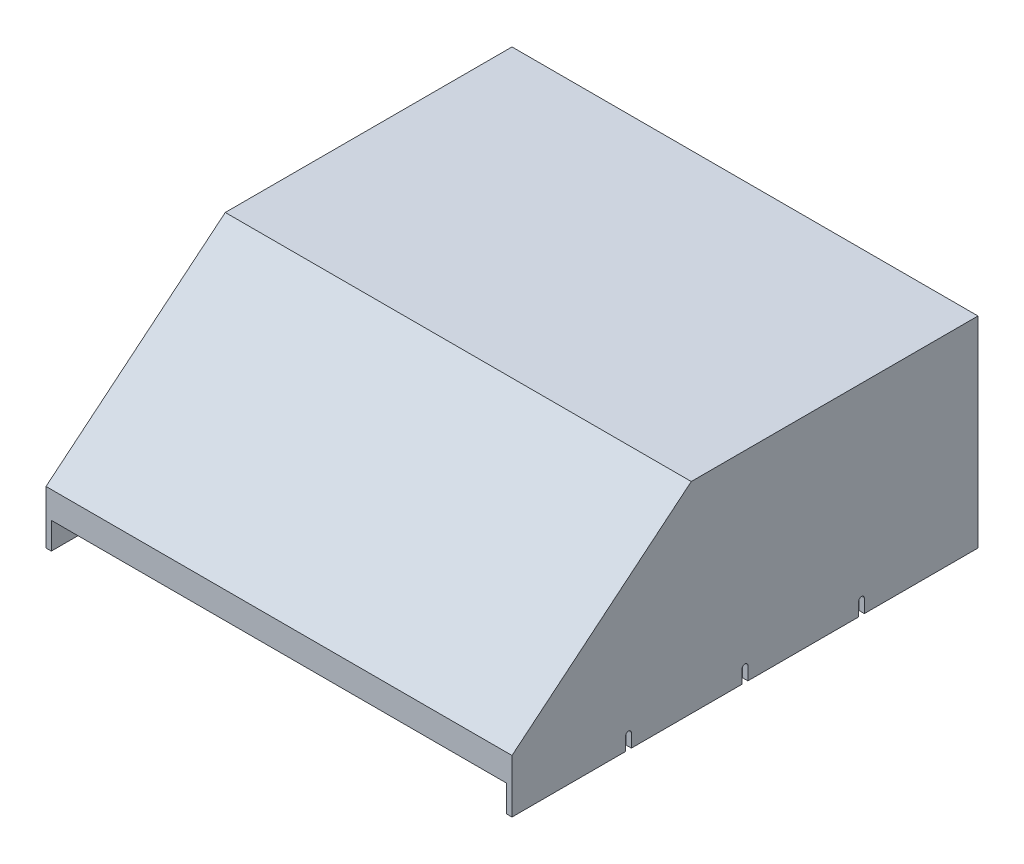
ISO-10303-21;
HEADER;
FILE_DESCRIPTION(('STEP AP214'),'2;1');
FILE_NAME('part.step','',(''),(''),'','','');
FILE_SCHEMA(('AUTOMOTIVE_DESIGN { 1 0 10303 214 1 1 1 1 }'));
ENDSEC;
DATA;
#1=APPLICATION_CONTEXT('core data for automotive mechanical design processes');
#2=APPLICATION_PROTOCOL_DEFINITION('international standard','automotive_design',2000,#1);
#3=PRODUCT_CONTEXT('',#1,'mechanical');
#4=PRODUCT('Part','Part','',(#3));
#5=PRODUCT_RELATED_PRODUCT_CATEGORY('part','',(#4));
#6=PRODUCT_DEFINITION_FORMATION('','',#4);
#7=PRODUCT_DEFINITION_CONTEXT('part definition',#1,'design');
#8=PRODUCT_DEFINITION('design','',#6,#7);
#9=PRODUCT_DEFINITION_SHAPE('','',#8);
#10=(LENGTH_UNIT() NAMED_UNIT(*) SI_UNIT(.MILLI.,.METRE.));
#11=(NAMED_UNIT(*) PLANE_ANGLE_UNIT() SI_UNIT($,.RADIAN.));
#12=(NAMED_UNIT(*) SI_UNIT($,.STERADIAN.) SOLID_ANGLE_UNIT());
#13=UNCERTAINTY_MEASURE_WITH_UNIT(LENGTH_MEASURE(1.E-05),#10,'distance_accuracy_value','');
#14=(GEOMETRIC_REPRESENTATION_CONTEXT(3) GLOBAL_UNCERTAINTY_ASSIGNED_CONTEXT((#13)) GLOBAL_UNIT_ASSIGNED_CONTEXT((#10,
#11,#12)) REPRESENTATION_CONTEXT('',''));
#15=CARTESIAN_POINT('',(0.,0.,0.));
#16=DIRECTION('',(0.,0.,1.));
#17=DIRECTION('',(1.,0.,0.));
#18=AXIS2_PLACEMENT_3D('',#15,#16,#17);
#19=CARTESIAN_POINT('',(524.,0.,0.));
#20=DIRECTION('',(0.,1.,0.));
#21=DIRECTION('',(0.,0.,1.));
#22=AXIS2_PLACEMENT_3D('',#19,#20,#21);
#23=PLANE('',#22);
#24=DIRECTION('',(0.,0.,-1.));
#25=VECTOR('',#24,1.);
#26=CARTESIAN_POINT('',(518.,0.,0.));
#27=LINE('',#26,#25);
#28=CARTESIAN_POINT('',(518.,0.,-134.25));
#29=VERTEX_POINT('',#28);
#30=CARTESIAN_POINT('',(518.,0.,-258.75));
#31=VERTEX_POINT('',#30);
#32=EDGE_CURVE('E476',#29,#31,#27,.T.);
#33=ORIENTED_EDGE('',*,*,#32,.T.);
#34=DIRECTION('',(-1.,0.,0.));
#35=VECTOR('',#34,1.);
#36=CARTESIAN_POINT('',(524.,0.,-258.75));
#37=LINE('',#36,#35);
#38=CARTESIAN_POINT('',(524.,0.,-258.75));
#39=VERTEX_POINT('',#38);
#40=EDGE_CURVE('E316',#39,#31,#37,.T.);
#41=ORIENTED_EDGE('',*,*,#40,.F.);
#42=DIRECTION('',(0.,0.,-1.));
#43=VECTOR('',#42,1.);
#44=CARTESIAN_POINT('',(524.,0.,0.));
#45=LINE('',#44,#43);
#46=CARTESIAN_POINT('',(524.,0.,-134.25));
#47=VERTEX_POINT('',#46);
#48=EDGE_CURVE('E487',#47,#39,#45,.T.);
#49=ORIENTED_EDGE('',*,*,#48,.F.);
#50=DIRECTION('',(-1.,0.,0.));
#51=VECTOR('',#50,1.);
#52=CARTESIAN_POINT('',(524.,0.,-134.25));
#53=LINE('',#52,#51);
#54=EDGE_CURVE('E351',#47,#29,#53,.T.);
#55=ORIENTED_EDGE('',*,*,#54,.T.);
#56=EDGE_LOOP('',(#33,#41,#49,#55));
#57=FACE_BOUND('',#56,.T.);
#58=ADVANCED_FACE('F37',(#57),#23,.F.);
#59=DIRECTION('',(0.,0.,-1.));
#60=VECTOR('',#59,1.);
#61=CARTESIAN_POINT('',(0.,0.,0.));
#62=LINE('',#61,#60);
#63=CARTESIAN_POINT('',(0.,0.,-134.25));
#64=VERTEX_POINT('',#63);
#65=CARTESIAN_POINT('',(0.,0.,-258.75));
#66=VERTEX_POINT('',#65);
#67=EDGE_CURVE('E503',#64,#66,#62,.T.);
#68=ORIENTED_EDGE('',*,*,#67,.T.);
#69=CARTESIAN_POINT('',(6.00000000000001,0.,-258.75));
#70=VERTEX_POINT('',#69);
#71=EDGE_CURVE('E318',#70,#66,#37,.T.);
#72=ORIENTED_EDGE('',*,*,#71,.F.);
#73=DIRECTION('',(0.,0.,-1.));
#74=VECTOR('',#73,1.);
#75=CARTESIAN_POINT('',(6.00000000000001,0.,0.));
#76=LINE('',#75,#74);
#77=CARTESIAN_POINT('',(6.00000000000001,0.,-134.25));
#78=VERTEX_POINT('',#77);
#79=EDGE_CURVE('E472',#78,#70,#76,.T.);
#80=ORIENTED_EDGE('',*,*,#79,.F.);
#81=EDGE_CURVE('E354',#78,#64,#53,.T.);
#82=ORIENTED_EDGE('',*,*,#81,.T.);
#83=EDGE_LOOP('',(#68,#72,#80,#82));
#84=FACE_BOUND('',#83,.T.);
#85=ADVANCED_FACE('F577',(#84),#23,.F.);
#86=CARTESIAN_POINT('',(518.,0.,0.));
#87=VERTEX_POINT('',#86);
#88=CARTESIAN_POINT('',(518.,0.,-127.75));
#89=VERTEX_POINT('',#88);
#90=EDGE_CURVE('E469',#87,#89,#27,.T.);
#91=ORIENTED_EDGE('',*,*,#90,.T.);
#92=DIRECTION('',(-1.,0.,0.));
#93=VECTOR('',#92,1.);
#94=CARTESIAN_POINT('',(524.,0.,-127.75));
#95=LINE('',#94,#93);
#96=CARTESIAN_POINT('',(524.,0.,-127.75));
#97=VERTEX_POINT('',#96);
#98=EDGE_CURVE('E348',#97,#89,#95,.T.);
#99=ORIENTED_EDGE('',*,*,#98,.F.);
#100=CARTESIAN_POINT('',(524.,0.,0.));
#101=VERTEX_POINT('',#100);
#102=EDGE_CURVE('E483',#101,#97,#45,.T.);
#103=ORIENTED_EDGE('',*,*,#102,.F.);
#104=DIRECTION('',(-1.,0.,0.));
#105=VECTOR('',#104,1.);
#106=CARTESIAN_POINT('',(524.,0.,0.));
#107=LINE('',#106,#105);
#108=EDGE_CURVE('E522',#101,#87,#107,.T.);
#109=ORIENTED_EDGE('',*,*,#108,.T.);
#110=EDGE_LOOP('',(#91,#99,#103,#109));
#111=FACE_BOUND('',#110,.T.);
#112=ADVANCED_FACE('F620',(#111),#23,.F.);
#113=CARTESIAN_POINT('',(0.,0.,0.));
#114=VERTEX_POINT('',#113);
#115=CARTESIAN_POINT('',(0.,0.,-127.75));
#116=VERTEX_POINT('',#115);
#117=EDGE_CURVE('E499',#114,#116,#62,.T.);
#118=ORIENTED_EDGE('',*,*,#117,.T.);
#119=CARTESIAN_POINT('',(6.00000000000001,0.,-127.75));
#120=VERTEX_POINT('',#119);
#121=EDGE_CURVE('E350',#120,#116,#95,.T.);
#122=ORIENTED_EDGE('',*,*,#121,.F.);
#123=CARTESIAN_POINT('',(6.,0.,0.));
#124=VERTEX_POINT('',#123);
#125=EDGE_CURVE('E467',#124,#120,#76,.T.);
#126=ORIENTED_EDGE('',*,*,#125,.F.);
#127=EDGE_CURVE('E521',#124,#114,#107,.T.);
#128=ORIENTED_EDGE('',*,*,#127,.T.);
#129=EDGE_LOOP('',(#118,#122,#126,#128));
#130=FACE_BOUND('',#129,.T.);
#131=ADVANCED_FACE('F715',(#130),#23,.F.);
#132=CARTESIAN_POINT('',(524.,0.,-265.25));
#133=VERTEX_POINT('',#132);
#134=CARTESIAN_POINT('',(524.,0.,-389.75));
#135=VERTEX_POINT('',#134);
#136=EDGE_CURVE('E488',#133,#135,#45,.T.);
#137=ORIENTED_EDGE('',*,*,#136,.F.);
#138=DIRECTION('',(-1.,0.,0.));
#139=VECTOR('',#138,1.);
#140=CARTESIAN_POINT('',(524.,0.,-265.25));
#141=LINE('',#140,#139);
#142=CARTESIAN_POINT('',(518.,0.,-265.25));
#143=VERTEX_POINT('',#142);
#144=EDGE_CURVE('E294',#133,#143,#141,.T.);
#145=ORIENTED_EDGE('',*,*,#144,.T.);
#146=CARTESIAN_POINT('',(518.,0.,-389.75));
#147=VERTEX_POINT('',#146);
#148=EDGE_CURVE('E477',#143,#147,#27,.T.);
#149=ORIENTED_EDGE('',*,*,#148,.T.);
#150=DIRECTION('',(-1.,0.,0.));
#151=VECTOR('',#150,1.);
#152=CARTESIAN_POINT('',(524.,0.,-389.75));
#153=LINE('',#152,#151);
#154=EDGE_CURVE('E388',#135,#147,#153,.T.);
#155=ORIENTED_EDGE('',*,*,#154,.F.);
#156=EDGE_LOOP('',(#137,#145,#149,#155));
#157=FACE_BOUND('',#156,.T.);
#158=ADVANCED_FACE('F642',(#157),#23,.F.);
#159=CARTESIAN_POINT('',(6.00000000000001,0.,-265.25));
#160=VERTEX_POINT('',#159);
#161=CARTESIAN_POINT('',(6.00000000000001,0.,-389.75));
#162=VERTEX_POINT('',#161);
#163=EDGE_CURVE('E473',#160,#162,#76,.T.);
#164=ORIENTED_EDGE('',*,*,#163,.F.);
#165=CARTESIAN_POINT('',(0.,0.,-265.25));
#166=VERTEX_POINT('',#165);
#167=EDGE_CURVE('E60',#160,#166,#141,.T.);
#168=ORIENTED_EDGE('',*,*,#167,.T.);
#169=CARTESIAN_POINT('',(0.,0.,-389.75));
#170=VERTEX_POINT('',#169);
#171=EDGE_CURVE('E504',#166,#170,#62,.T.);
#172=ORIENTED_EDGE('',*,*,#171,.T.);
#173=EDGE_CURVE('E391',#162,#170,#153,.T.);
#174=ORIENTED_EDGE('',*,*,#173,.F.);
#175=EDGE_LOOP('',(#164,#168,#172,#174));
#176=FACE_BOUND('',#175,.T.);
#177=ADVANCED_FACE('F587',(#176),#23,.F.);
#178=CARTESIAN_POINT('',(524.,0.,-396.25));
#179=VERTEX_POINT('',#178);
#180=CARTESIAN_POINT('',(524.,0.,-524.));
#181=VERTEX_POINT('',#180);
#182=EDGE_CURVE('E481',#179,#181,#45,.T.);
#183=ORIENTED_EDGE('',*,*,#182,.F.);
#184=DIRECTION('',(-1.,0.,0.));
#185=VECTOR('',#184,1.);
#186=CARTESIAN_POINT('',(524.,0.,-396.25));
#187=LINE('',#186,#185);
#188=CARTESIAN_POINT('',(518.,0.,-396.25));
#189=VERTEX_POINT('',#188);
#190=EDGE_CURVE('E392',#179,#189,#187,.T.);
#191=ORIENTED_EDGE('',*,*,#190,.T.);
#192=CARTESIAN_POINT('',(518.,0.,-524.));
#193=VERTEX_POINT('',#192);
#194=EDGE_CURVE('E444',#189,#193,#27,.T.);
#195=ORIENTED_EDGE('',*,*,#194,.T.);
#196=DIRECTION('',(-1.,0.,0.));
#197=VECTOR('',#196,1.);
#198=CARTESIAN_POINT('',(524.,0.,-524.));
#199=LINE('',#198,#197);
#200=EDGE_CURVE('E518',#181,#193,#199,.T.);
#201=ORIENTED_EDGE('',*,*,#200,.F.);
#202=EDGE_LOOP('',(#183,#191,#195,#201));
#203=FACE_BOUND('',#202,.T.);
#204=ADVANCED_FACE('F625',(#203),#23,.F.);
#205=CARTESIAN_POINT('',(524.,-5.08934094474187E-13,-518.));
#206=DIRECTION('',(0.,0.,1.));
#207=DIRECTION('',(0.,-1.,0.));
#208=AXIS2_PLACEMENT_3D('',#205,#206,#207);
#209=PLANE('',#208);
#210=DIRECTION('',(0.,1.,0.));
#211=VECTOR('',#210,1.);
#212=CARTESIAN_POINT('',(6.00000000000001,-5.08934094474187E-13,-518.));
#213=LINE('',#212,#211);
#214=CARTESIAN_POINT('',(6.00000000000001,80.,-518.));
#215=VERTEX_POINT('',#214);
#216=CARTESIAN_POINT('',(6.,220.,-518.));
#217=VERTEX_POINT('',#216);
#218=EDGE_CURVE('E460',#215,#217,#213,.T.);
#219=ORIENTED_EDGE('',*,*,#218,.F.);
#220=DIRECTION('',(-1.,0.,0.));
#221=VECTOR('',#220,1.);
#222=CARTESIAN_POINT('',(518.,80.,-518.));
#223=LINE('',#222,#221);
#224=CARTESIAN_POINT('',(518.,80.,-518.));
#225=VERTEX_POINT('',#224);
#226=EDGE_CURVE('E406',#225,#215,#223,.T.);
#227=ORIENTED_EDGE('',*,*,#226,.F.);
#228=DIRECTION('',(0.,1.,0.));
#229=VECTOR('',#228,1.);
#230=CARTESIAN_POINT('',(518.,-5.08934094474187E-13,-518.));
#231=LINE('',#230,#229);
#232=CARTESIAN_POINT('',(518.,220.,-518.));
#233=VERTEX_POINT('',#232);
#234=EDGE_CURVE('E462',#225,#233,#231,.T.);
#235=ORIENTED_EDGE('',*,*,#234,.T.);
#236=DIRECTION('',(-1.,0.,0.));
#237=VECTOR('',#236,1.);
#238=CARTESIAN_POINT('',(524.,220.,-518.));
#239=LINE('',#238,#237);
#240=EDGE_CURVE('E457',#233,#217,#239,.T.);
#241=ORIENTED_EDGE('',*,*,#240,.T.);
#242=EDGE_LOOP('',(#219,#227,#235,#241));
#243=FACE_BOUND('',#242,.T.);
#244=ADVANCED_FACE('F631',(#243),#209,.T.);
#245=CARTESIAN_POINT('',(524.,0.,-6.));
#246=DIRECTION('',(0.,0.,-1.));
#247=DIRECTION('',(0.,1.,0.));
#248=AXIS2_PLACEMENT_3D('',#245,#246,#247);
#249=PLANE('',#248);
#250=DIRECTION('',(0.,-1.,0.));
#251=VECTOR('',#250,1.);
#252=CARTESIAN_POINT('',(518.,0.,-6.));
#253=LINE('',#252,#251);
#254=CARTESIAN_POINT('',(518.,57.1684113347274,-6.00000000000021));
#255=VERTEX_POINT('',#254);
#256=CARTESIAN_POINT('',(518.,30.,-6.));
#257=VERTEX_POINT('',#256);
#258=EDGE_CURVE('E441',#255,#257,#253,.T.);
#259=ORIENTED_EDGE('',*,*,#258,.T.);
#260=DIRECTION('',(1.,0.,0.));
#261=VECTOR('',#260,1.);
#262=CARTESIAN_POINT('',(6.,30.,-6.));
#263=LINE('',#262,#261);
#264=CARTESIAN_POINT('',(6.,30.,-6.));
#265=VERTEX_POINT('',#264);
#266=EDGE_CURVE('E419',#265,#257,#263,.T.);
#267=ORIENTED_EDGE('',*,*,#266,.F.);
#268=DIRECTION('',(0.,-1.,0.));
#269=VECTOR('',#268,1.);
#270=CARTESIAN_POINT('',(6.00000000000001,0.,-6.));
#271=LINE('',#270,#269);
#272=CARTESIAN_POINT('',(6.,57.1684113347274,-6.00000000000021));
#273=VERTEX_POINT('',#272);
#274=EDGE_CURVE('E435',#273,#265,#271,.T.);
#275=ORIENTED_EDGE('',*,*,#274,.F.);
#276=DIRECTION('',(-1.,0.,0.));
#277=VECTOR('',#276,1.);
#278=CARTESIAN_POINT('',(524.,57.1684113347274,-6.00000000000021));
#279=LINE('',#278,#277);
#280=EDGE_CURVE('E446',#255,#273,#279,.T.);
#281=ORIENTED_EDGE('',*,*,#280,.F.);
#282=EDGE_LOOP('',(#259,#267,#275,#281));
#283=FACE_BOUND('',#282,.T.);
#284=ADVANCED_FACE('F624',(#283),#249,.T.);
#285=CARTESIAN_POINT('',(6.00000000000001,0.,-396.25));
#286=VERTEX_POINT('',#285);
#287=CARTESIAN_POINT('',(6.,0.,-524.));
#288=VERTEX_POINT('',#287);
#289=EDGE_CURVE('E440',#286,#288,#76,.T.);
#290=ORIENTED_EDGE('',*,*,#289,.F.);
#291=CARTESIAN_POINT('',(0.,0.,-396.25));
#292=VERTEX_POINT('',#291);
#293=EDGE_CURVE('E395',#286,#292,#187,.T.);
#294=ORIENTED_EDGE('',*,*,#293,.T.);
#295=CARTESIAN_POINT('',(0.,0.,-524.));
#296=VERTEX_POINT('',#295);
#297=EDGE_CURVE('E498',#292,#296,#62,.T.);
#298=ORIENTED_EDGE('',*,*,#297,.T.);
#299=EDGE_CURVE('E517',#288,#296,#199,.T.);
#300=ORIENTED_EDGE('',*,*,#299,.F.);
#301=EDGE_LOOP('',(#290,#294,#298,#300));
#302=FACE_BOUND('',#301,.T.);
#303=ADVANCED_FACE('F571',(#302),#23,.F.);
#304=CARTESIAN_POINT('',(524.,0.,0.));
#305=DIRECTION('',(0.,0.,-1.));
#306=DIRECTION('',(0.,1.,0.));
#307=AXIS2_PLACEMENT_3D('',#304,#305,#306);
#308=PLANE('',#307);
#309=ORIENTED_EDGE('',*,*,#127,.F.);
#310=DIRECTION('',(0.,-1.,0.));
#311=VECTOR('',#310,1.);
#312=CARTESIAN_POINT('',(6.,30.,0.));
#313=LINE('',#312,#311);
#314=CARTESIAN_POINT('',(6.,30.,0.));
#315=VERTEX_POINT('',#314);
#316=EDGE_CURVE('E432',#315,#124,#313,.T.);
#317=ORIENTED_EDGE('',*,*,#316,.F.);
#318=DIRECTION('',(-1.,0.,0.));
#319=VECTOR('',#318,1.);
#320=CARTESIAN_POINT('',(518.,30.,0.));
#321=LINE('',#320,#319);
#322=CARTESIAN_POINT('',(518.,30.,0.));
#323=VERTEX_POINT('',#322);
#324=EDGE_CURVE('E427',#323,#315,#321,.T.);
#325=ORIENTED_EDGE('',*,*,#324,.F.);
#326=DIRECTION('',(0.,-1.,0.));
#327=VECTOR('',#326,1.);
#328=CARTESIAN_POINT('',(518.,30.,0.));
#329=LINE('',#328,#327);
#330=EDGE_CURVE('E431',#323,#87,#329,.T.);
#331=ORIENTED_EDGE('',*,*,#330,.T.);
#332=ORIENTED_EDGE('',*,*,#108,.F.);
#333=DIRECTION('',(0.,-1.,0.));
#334=VECTOR('',#333,1.);
#335=CARTESIAN_POINT('',(524.,0.,0.));
#336=LINE('',#335,#334);
#337=CARTESIAN_POINT('',(524.,60.0000000000001,-2.22044604925031E-13));
#338=VERTEX_POINT('',#337);
#339=EDGE_CURVE('E478',#338,#101,#336,.T.);
#340=ORIENTED_EDGE('',*,*,#339,.F.);
#341=DIRECTION('',(-1.,0.,0.));
#342=VECTOR('',#341,1.);
#343=CARTESIAN_POINT('',(524.,60.0000000000001,-2.22044604925031E-13));
#344=LINE('',#343,#342);
#345=CARTESIAN_POINT('',(0.,60.0000000000001,-2.22044604925031E-13));
#346=VERTEX_POINT('',#345);
#347=EDGE_CURVE('E495',#338,#346,#344,.T.);
#348=ORIENTED_EDGE('',*,*,#347,.T.);
#349=DIRECTION('',(0.,-1.,0.));
#350=VECTOR('',#349,1.);
#351=CARTESIAN_POINT('',(0.,0.,0.));
#352=LINE('',#351,#350);
#353=EDGE_CURVE('E465',#346,#114,#352,.T.);
#354=ORIENTED_EDGE('',*,*,#353,.T.);
#355=EDGE_LOOP('',(#309,#317,#325,#331,#332,#340,#348,#354));
#356=FACE_BOUND('',#355,.T.);
#357=ADVANCED_FACE('F39',(#356),#308,.F.);
#358=CARTESIAN_POINT('',(524.,-5.14829083985471E-13,-524.));
#359=DIRECTION('',(0.,0.,1.));
#360=DIRECTION('',(0.,-1.,0.));
#361=AXIS2_PLACEMENT_3D('',#358,#359,#360);
#362=PLANE('',#361);
#363=ORIENTED_EDGE('',*,*,#200,.T.);
#364=DIRECTION('',(0.,-1.,0.));
#365=VECTOR('',#364,1.);
#366=CARTESIAN_POINT('',(518.,80.,-524.));
#367=LINE('',#366,#365);
#368=CARTESIAN_POINT('',(518.,80.,-524.));
#369=VERTEX_POINT('',#368);
#370=EDGE_CURVE('E416',#369,#193,#367,.T.);
#371=ORIENTED_EDGE('',*,*,#370,.F.);
#372=DIRECTION('',(1.,0.,0.));
#373=VECTOR('',#372,1.);
#374=CARTESIAN_POINT('',(518.,80.,-524.));
#375=LINE('',#374,#373);
#376=CARTESIAN_POINT('',(6.,80.,-524.));
#377=VERTEX_POINT('',#376);
#378=EDGE_CURVE('E411',#377,#369,#375,.T.);
#379=ORIENTED_EDGE('',*,*,#378,.F.);
#380=DIRECTION('',(0.,-1.,0.));
#381=VECTOR('',#380,1.);
#382=CARTESIAN_POINT('',(6.,80.,-524.));
#383=LINE('',#382,#381);
#384=EDGE_CURVE('E415',#377,#288,#383,.T.);
#385=ORIENTED_EDGE('',*,*,#384,.T.);
#386=ORIENTED_EDGE('',*,*,#299,.T.);
#387=DIRECTION('',(0.,1.,0.));
#388=VECTOR('',#387,1.);
#389=CARTESIAN_POINT('',(0.,-5.14829083985471E-13,-524.));
#390=LINE('',#389,#388);
#391=CARTESIAN_POINT('',(0.,226.,-524.));
#392=VERTEX_POINT('',#391);
#393=EDGE_CURVE('E502',#296,#392,#390,.T.);
#394=ORIENTED_EDGE('',*,*,#393,.T.);
#395=DIRECTION('',(-1.,0.,0.));
#396=VECTOR('',#395,1.);
#397=CARTESIAN_POINT('',(524.,226.,-524.));
#398=LINE('',#397,#396);
#399=CARTESIAN_POINT('',(524.,226.,-524.));
#400=VERTEX_POINT('',#399);
#401=EDGE_CURVE('E514',#400,#392,#398,.T.);
#402=ORIENTED_EDGE('',*,*,#401,.F.);
#403=DIRECTION('',(0.,1.,0.));
#404=VECTOR('',#403,1.);
#405=CARTESIAN_POINT('',(524.,-5.14829083985471E-13,-524.));
#406=LINE('',#405,#404);
#407=EDGE_CURVE('E486',#181,#400,#406,.T.);
#408=ORIENTED_EDGE('',*,*,#407,.F.);
#409=EDGE_LOOP('',(#363,#371,#379,#385,#386,#394,#402,#408));
#410=FACE_BOUND('',#409,.T.);
#411=ADVANCED_FACE('F568',(#410),#362,.F.);
#412=CARTESIAN_POINT('',(524.,226.,0.));
#413=DIRECTION('',(0.,-1.,0.));
#414=DIRECTION('',(0.,0.,-1.));
#415=AXIS2_PLACEMENT_3D('',#412,#413,#414);
#416=PLANE('',#415);
#417=DIRECTION('',(0.,0.,1.));
#418=VECTOR('',#417,1.);
#419=CARTESIAN_POINT('',(0.,226.,0.));
#420=LINE('',#419,#418);
#421=CARTESIAN_POINT('',(0.,226.,-201.57613210619));
#422=VERTEX_POINT('',#421);
#423=EDGE_CURVE('E506',#392,#422,#420,.T.);
#424=ORIENTED_EDGE('',*,*,#423,.T.);
#425=DIRECTION('',(-1.,0.,0.));
#426=VECTOR('',#425,1.);
#427=CARTESIAN_POINT('',(524.,226.,-201.57613210619));
#428=LINE('',#427,#426);
#429=CARTESIAN_POINT('',(524.,226.,-201.57613210619));
#430=VERTEX_POINT('',#429);
#431=EDGE_CURVE('E512',#430,#422,#428,.T.);
#432=ORIENTED_EDGE('',*,*,#431,.F.);
#433=DIRECTION('',(0.,0.,1.));
#434=VECTOR('',#433,1.);
#435=CARTESIAN_POINT('',(524.,226.,0.));
#436=LINE('',#435,#434);
#437=EDGE_CURVE('E490',#400,#430,#436,.T.);
#438=ORIENTED_EDGE('',*,*,#437,.F.);
#439=ORIENTED_EDGE('',*,*,#401,.T.);
#440=EDGE_LOOP('',(#424,#432,#438,#439));
#441=FACE_BOUND('',#440,.T.);
#442=ADVANCED_FACE('F671',(#441),#416,.F.);
#443=CARTESIAN_POINT('',(524.,35.7532515992443,29.4431672215438));
#444=DIRECTION('',(0.,0.771937514734238,0.63569841382996));
#445=DIRECTION('',(0.,-0.63569841382996,0.771937514734238));
#446=AXIS2_PLACEMENT_3D('',#443,#444,#445);
#447=PLANE('',#446);
#448=DIRECTION('',(0.,0.635698413829961,-0.771937514734238));
#449=VECTOR('',#448,1.);
#450=CARTESIAN_POINT('',(0.,35.7532515992443,29.4431672215438));
#451=LINE('',#450,#449);
#452=EDGE_CURVE('E482',#346,#422,#451,.T.);
#453=ORIENTED_EDGE('',*,*,#452,.F.);
#454=ORIENTED_EDGE('',*,*,#347,.F.);
#455=DIRECTION('',(0.,0.635698413829961,-0.771937514734238));
#456=VECTOR('',#455,1.);
#457=CARTESIAN_POINT('',(524.,35.7532515992443,29.4431672215438));
#458=LINE('',#457,#456);
#459=EDGE_CURVE('E492',#338,#430,#458,.T.);
#460=ORIENTED_EDGE('',*,*,#459,.T.);
#461=ORIENTED_EDGE('',*,*,#431,.T.);
#462=EDGE_LOOP('',(#453,#454,#460,#461));
#463=FACE_BOUND('',#462,.T.);
#464=ADVANCED_FACE('F675',(#463),#447,.T.);
#465=CARTESIAN_POINT('',(524.,0.,0.));
#466=DIRECTION('',(1.,0.,0.));
#467=DIRECTION('',(0.,0.,-1.));
#468=AXIS2_PLACEMENT_3D('',#465,#466,#467);
#469=PLANE('',#468);
#470=DIRECTION('',(0.,1.,0.));
#471=VECTOR('',#470,1.);
#472=CARTESIAN_POINT('',(524.,15.,-258.75));
#473=LINE('',#472,#471);
#474=CARTESIAN_POINT('',(524.,15.,-258.75));
#475=VERTEX_POINT('',#474);
#476=EDGE_CURVE('E297',#39,#475,#473,.T.);
#477=ORIENTED_EDGE('',*,*,#476,.T.);
#478=CARTESIAN_POINT('',(524.,15.,-262.));
#479=DIRECTION('',(-1.,0.,0.));
#480=DIRECTION('',(0.,0.,-1.));
#481=AXIS2_PLACEMENT_3D('',#478,#479,#480);
#482=CIRCLE('',#481,3.24999999999998);
#483=CARTESIAN_POINT('',(524.,15.,-265.25));
#484=VERTEX_POINT('',#483);
#485=EDGE_CURVE('E283',#475,#484,#482,.T.);
#486=ORIENTED_EDGE('',*,*,#485,.T.);
#487=DIRECTION('',(0.,-1.,0.));
#488=VECTOR('',#487,1.);
#489=CARTESIAN_POINT('',(524.,15.,-265.25));
#490=LINE('',#489,#488);
#491=EDGE_CURVE('E291',#484,#133,#490,.T.);
#492=ORIENTED_EDGE('',*,*,#491,.T.);
#493=ORIENTED_EDGE('',*,*,#136,.T.);
#494=DIRECTION('',(0.,1.,0.));
#495=VECTOR('',#494,1.);
#496=CARTESIAN_POINT('',(524.,15.,-389.75));
#497=LINE('',#496,#495);
#498=CARTESIAN_POINT('',(524.,15.,-389.75));
#499=VERTEX_POINT('',#498);
#500=EDGE_CURVE('E373',#135,#499,#497,.T.);
#501=ORIENTED_EDGE('',*,*,#500,.T.);
#502=CARTESIAN_POINT('',(524.,15.,-393.));
#503=DIRECTION('',(-1.,0.,0.));
#504=DIRECTION('',(0.,0.,-1.));
#505=AXIS2_PLACEMENT_3D('',#502,#503,#504);
#506=CIRCLE('',#505,3.24999999999998);
#507=CARTESIAN_POINT('',(524.,15.,-396.25));
#508=VERTEX_POINT('',#507);
#509=EDGE_CURVE('E366',#499,#508,#506,.T.);
#510=ORIENTED_EDGE('',*,*,#509,.T.);
#511=DIRECTION('',(0.,-1.,0.));
#512=VECTOR('',#511,1.);
#513=CARTESIAN_POINT('',(524.,15.,-396.25));
#514=LINE('',#513,#512);
#515=EDGE_CURVE('E369',#508,#179,#514,.T.);
#516=ORIENTED_EDGE('',*,*,#515,.T.);
#517=ORIENTED_EDGE('',*,*,#182,.T.);
#518=ORIENTED_EDGE('',*,*,#407,.T.);
#519=ORIENTED_EDGE('',*,*,#437,.T.);
#520=ORIENTED_EDGE('',*,*,#459,.F.);
#521=ORIENTED_EDGE('',*,*,#339,.T.);
#522=ORIENTED_EDGE('',*,*,#102,.T.);
#523=DIRECTION('',(0.,1.,0.));
#524=VECTOR('',#523,1.);
#525=CARTESIAN_POINT('',(524.,15.,-127.75));
#526=LINE('',#525,#524);
#527=CARTESIAN_POINT('',(524.,15.,-127.75));
#528=VERTEX_POINT('',#527);
#529=EDGE_CURVE('E333',#97,#528,#526,.T.);
#530=ORIENTED_EDGE('',*,*,#529,.T.);
#531=CARTESIAN_POINT('',(524.,15.,-131.));
#532=DIRECTION('',(-1.,0.,0.));
#533=DIRECTION('',(0.,0.,-1.));
#534=AXIS2_PLACEMENT_3D('',#531,#532,#533);
#535=CIRCLE('',#534,3.24999999999998);
#536=CARTESIAN_POINT('',(524.,15.,-134.25));
#537=VERTEX_POINT('',#536);
#538=EDGE_CURVE('E326',#528,#537,#535,.T.);
#539=ORIENTED_EDGE('',*,*,#538,.T.);
#540=DIRECTION('',(0.,-1.,0.));
#541=VECTOR('',#540,1.);
#542=CARTESIAN_POINT('',(524.,15.,-134.25));
#543=LINE('',#542,#541);
#544=EDGE_CURVE('E329',#537,#47,#543,.T.);
#545=ORIENTED_EDGE('',*,*,#544,.T.);
#546=ORIENTED_EDGE('',*,*,#48,.T.);
#547=EDGE_LOOP('',(#477,#486,#492,#493,#501,#510,#516,#517,#518,#519,#520,#521,#522,#530,#539,
#545,#546));
#548=FACE_BOUND('',#547,.T.);
#549=ADVANCED_FACE('F299',(#548),#469,.T.);
#550=CARTESIAN_POINT('',(0.,0.,0.));
#551=DIRECTION('',(1.,0.,0.));
#552=DIRECTION('',(0.,0.,-1.));
#553=AXIS2_PLACEMENT_3D('',#550,#551,#552);
#554=PLANE('',#553);
#555=CARTESIAN_POINT('',(0.,15.,-262.));
#556=DIRECTION('',(-1.,0.,0.));
#557=DIRECTION('',(0.,0.,-1.));
#558=AXIS2_PLACEMENT_3D('',#555,#556,#557);
#559=CIRCLE('',#558,3.24999999999998);
#560=CARTESIAN_POINT('',(0.,15.,-258.75));
#561=VERTEX_POINT('',#560);
#562=CARTESIAN_POINT('',(0.,15.,-265.25));
#563=VERTEX_POINT('',#562);
#564=EDGE_CURVE('E308',#561,#563,#559,.T.);
#565=ORIENTED_EDGE('',*,*,#564,.F.);
#566=DIRECTION('',(0.,1.,0.));
#567=VECTOR('',#566,1.);
#568=CARTESIAN_POINT('',(0.,15.,-258.75));
#569=LINE('',#568,#567);
#570=EDGE_CURVE('E301',#66,#561,#569,.T.);
#571=ORIENTED_EDGE('',*,*,#570,.F.);
#572=ORIENTED_EDGE('',*,*,#67,.F.);
#573=DIRECTION('',(0.,-1.,0.));
#574=VECTOR('',#573,1.);
#575=CARTESIAN_POINT('',(0.,15.,-134.25));
#576=LINE('',#575,#574);
#577=CARTESIAN_POINT('',(0.,15.,-134.25));
#578=VERTEX_POINT('',#577);
#579=EDGE_CURVE('E339',#578,#64,#576,.T.);
#580=ORIENTED_EDGE('',*,*,#579,.F.);
#581=CARTESIAN_POINT('',(0.,15.,-131.));
#582=DIRECTION('',(-1.,0.,0.));
#583=DIRECTION('',(0.,0.,-1.));
#584=AXIS2_PLACEMENT_3D('',#581,#582,#583);
#585=CIRCLE('',#584,3.24999999999998);
#586=CARTESIAN_POINT('',(0.,15.,-127.75));
#587=VERTEX_POINT('',#586);
#588=EDGE_CURVE('E325',#587,#578,#585,.T.);
#589=ORIENTED_EDGE('',*,*,#588,.F.);
#590=DIRECTION('',(0.,1.,0.));
#591=VECTOR('',#590,1.);
#592=CARTESIAN_POINT('',(0.,15.,-127.75));
#593=LINE('',#592,#591);
#594=EDGE_CURVE('E330',#116,#587,#593,.T.);
#595=ORIENTED_EDGE('',*,*,#594,.F.);
#596=ORIENTED_EDGE('',*,*,#117,.F.);
#597=ORIENTED_EDGE('',*,*,#353,.F.);
#598=ORIENTED_EDGE('',*,*,#452,.T.);
#599=ORIENTED_EDGE('',*,*,#423,.F.);
#600=ORIENTED_EDGE('',*,*,#393,.F.);
#601=ORIENTED_EDGE('',*,*,#297,.F.);
#602=DIRECTION('',(0.,-1.,0.));
#603=VECTOR('',#602,1.);
#604=CARTESIAN_POINT('',(0.,15.,-396.25));
#605=LINE('',#604,#603);
#606=CARTESIAN_POINT('',(0.,15.,-396.25));
#607=VERTEX_POINT('',#606);
#608=EDGE_CURVE('E379',#607,#292,#605,.T.);
#609=ORIENTED_EDGE('',*,*,#608,.F.);
#610=CARTESIAN_POINT('',(0.,15.,-393.));
#611=DIRECTION('',(-1.,0.,0.));
#612=DIRECTION('',(0.,0.,-1.));
#613=AXIS2_PLACEMENT_3D('',#610,#611,#612);
#614=CIRCLE('',#613,3.24999999999998);
#615=CARTESIAN_POINT('',(0.,15.,-389.75));
#616=VERTEX_POINT('',#615);
#617=EDGE_CURVE('E365',#616,#607,#614,.T.);
#618=ORIENTED_EDGE('',*,*,#617,.F.);
#619=DIRECTION('',(0.,1.,0.));
#620=VECTOR('',#619,1.);
#621=CARTESIAN_POINT('',(0.,15.,-389.75));
#622=LINE('',#621,#620);
#623=EDGE_CURVE('E370',#170,#616,#622,.T.);
#624=ORIENTED_EDGE('',*,*,#623,.F.);
#625=ORIENTED_EDGE('',*,*,#171,.F.);
#626=DIRECTION('',(0.,-1.,0.));
#627=VECTOR('',#626,1.);
#628=CARTESIAN_POINT('',(0.,15.,-265.25));
#629=LINE('',#628,#627);
#630=EDGE_CURVE('E304',#563,#166,#629,.T.);
#631=ORIENTED_EDGE('',*,*,#630,.F.);
#632=EDGE_LOOP('',(#565,#571,#572,#580,#589,#595,#596,#597,#598,#599,#600,#601,#609,#618,#624,
#625,#631));
#633=FACE_BOUND('',#632,.T.);
#634=ADVANCED_FACE('F579',(#633),#554,.F.);
#635=CARTESIAN_POINT('',(524.,220.,0.));
#636=DIRECTION('',(0.,-1.,0.));
#637=DIRECTION('',(0.,0.,-1.));
#638=AXIS2_PLACEMENT_3D('',#635,#636,#637);
#639=PLANE('',#638);
#640=DIRECTION('',(0.,0.,1.));
#641=VECTOR('',#640,1.);
#642=CARTESIAN_POINT('',(6.00000000000001,220.,0.));
#643=LINE('',#642,#641);
#644=CARTESIAN_POINT('',(6.,220.,-203.728685709951));
#645=VERTEX_POINT('',#644);
#646=EDGE_CURVE('E452',#217,#645,#643,.T.);
#647=ORIENTED_EDGE('',*,*,#646,.F.);
#648=ORIENTED_EDGE('',*,*,#240,.F.);
#649=DIRECTION('',(0.,0.,1.));
#650=VECTOR('',#649,1.);
#651=CARTESIAN_POINT('',(518.,220.,0.));
#652=LINE('',#651,#650);
#653=CARTESIAN_POINT('',(518.,220.,-203.728685709951));
#654=VERTEX_POINT('',#653);
#655=EDGE_CURVE('E455',#233,#654,#652,.T.);
#656=ORIENTED_EDGE('',*,*,#655,.T.);
#657=DIRECTION('',(-1.,0.,0.));
#658=VECTOR('',#657,1.);
#659=CARTESIAN_POINT('',(524.,220.,-203.728685709951));
#660=LINE('',#659,#658);
#661=EDGE_CURVE('E448',#654,#645,#660,.T.);
#662=ORIENTED_EDGE('',*,*,#661,.T.);
#663=EDGE_LOOP('',(#647,#648,#656,#662));
#664=FACE_BOUND('',#663,.T.);
#665=ADVANCED_FACE('F733',(#664),#639,.T.);
#666=CARTESIAN_POINT('',(524.,31.1216265108388,25.628976738564));
#667=DIRECTION('',(0.,0.771937514734238,0.63569841382996));
#668=DIRECTION('',(0.,-0.63569841382996,0.771937514734238));
#669=AXIS2_PLACEMENT_3D('',#666,#667,#668);
#670=PLANE('',#669);
#671=DIRECTION('',(0.,0.63569841382996,-0.771937514734238));
#672=VECTOR('',#671,1.);
#673=CARTESIAN_POINT('',(6.00000000000001,31.1216265108388,25.628976738564));
#674=LINE('',#673,#672);
#675=EDGE_CURVE('E445',#273,#645,#674,.T.);
#676=ORIENTED_EDGE('',*,*,#675,.T.);
#677=ORIENTED_EDGE('',*,*,#661,.F.);
#678=DIRECTION('',(0.,0.63569841382996,-0.771937514734238));
#679=VECTOR('',#678,1.);
#680=CARTESIAN_POINT('',(518.,31.1216265108388,25.628976738564));
#681=LINE('',#680,#679);
#682=EDGE_CURVE('E449',#255,#654,#681,.T.);
#683=ORIENTED_EDGE('',*,*,#682,.F.);
#684=ORIENTED_EDGE('',*,*,#280,.T.);
#685=EDGE_LOOP('',(#676,#677,#683,#684));
#686=FACE_BOUND('',#685,.T.);
#687=ADVANCED_FACE('F730',(#686),#670,.F.);
#688=CARTESIAN_POINT('',(518.,0.,0.));
#689=DIRECTION('',(1.,0.,0.));
#690=DIRECTION('',(0.,0.,-1.));
#691=AXIS2_PLACEMENT_3D('',#688,#689,#690);
#692=PLANE('',#691);
#693=CARTESIAN_POINT('',(518.,15.,-262.));
#694=DIRECTION('',(1.,0.,0.));
#695=DIRECTION('',(0.,0.,-1.));
#696=AXIS2_PLACEMENT_3D('',#693,#694,#695);
#697=CIRCLE('',#696,3.24999999999998);
#698=CARTESIAN_POINT('',(518.,15.,-265.25));
#699=VERTEX_POINT('',#698);
#700=CARTESIAN_POINT('',(518.,15.,-258.75));
#701=VERTEX_POINT('',#700);
#702=EDGE_CURVE('E286',#699,#701,#697,.T.);
#703=ORIENTED_EDGE('',*,*,#702,.T.);
#704=DIRECTION('',(0.,-1.,0.));
#705=VECTOR('',#704,1.);
#706=CARTESIAN_POINT('',(518.,0.,-258.75));
#707=LINE('',#706,#705);
#708=EDGE_CURVE('E321',#701,#31,#707,.T.);
#709=ORIENTED_EDGE('',*,*,#708,.T.);
#710=ORIENTED_EDGE('',*,*,#32,.F.);
#711=DIRECTION('',(0.,1.,0.));
#712=VECTOR('',#711,1.);
#713=CARTESIAN_POINT('',(518.,0.,-134.25));
#714=LINE('',#713,#712);
#715=CARTESIAN_POINT('',(518.,15.,-134.25));
#716=VERTEX_POINT('',#715);
#717=EDGE_CURVE('E346',#29,#716,#714,.T.);
#718=ORIENTED_EDGE('',*,*,#717,.T.);
#719=CARTESIAN_POINT('',(518.,15.,-131.));
#720=DIRECTION('',(1.,0.,0.));
#721=DIRECTION('',(0.,0.,-1.));
#722=AXIS2_PLACEMENT_3D('',#719,#720,#721);
#723=CIRCLE('',#722,3.24999999999998);
#724=CARTESIAN_POINT('',(518.,15.,-127.75));
#725=VERTEX_POINT('',#724);
#726=EDGE_CURVE('E362',#716,#725,#723,.T.);
#727=ORIENTED_EDGE('',*,*,#726,.T.);
#728=DIRECTION('',(0.,-1.,0.));
#729=VECTOR('',#728,1.);
#730=CARTESIAN_POINT('',(518.,0.,-127.75));
#731=LINE('',#730,#729);
#732=EDGE_CURVE('E359',#725,#89,#731,.T.);
#733=ORIENTED_EDGE('',*,*,#732,.T.);
#734=ORIENTED_EDGE('',*,*,#90,.F.);
#735=ORIENTED_EDGE('',*,*,#330,.F.);
#736=DIRECTION('',(0.,0.,1.));
#737=VECTOR('',#736,1.);
#738=CARTESIAN_POINT('',(518.,30.,-6.));
#739=LINE('',#738,#737);
#740=EDGE_CURVE('E424',#257,#323,#739,.T.);
#741=ORIENTED_EDGE('',*,*,#740,.F.);
#742=ORIENTED_EDGE('',*,*,#258,.F.);
#743=ORIENTED_EDGE('',*,*,#682,.T.);
#744=ORIENTED_EDGE('',*,*,#655,.F.);
#745=ORIENTED_EDGE('',*,*,#234,.F.);
#746=DIRECTION('',(0.,0.,1.));
#747=VECTOR('',#746,1.);
#748=CARTESIAN_POINT('',(518.,80.,-518.));
#749=LINE('',#748,#747);
#750=EDGE_CURVE('E413',#369,#225,#749,.T.);
#751=ORIENTED_EDGE('',*,*,#750,.F.);
#752=ORIENTED_EDGE('',*,*,#370,.T.);
#753=ORIENTED_EDGE('',*,*,#194,.F.);
#754=DIRECTION('',(0.,1.,0.));
#755=VECTOR('',#754,1.);
#756=CARTESIAN_POINT('',(518.,0.,-396.25));
#757=LINE('',#756,#755);
#758=CARTESIAN_POINT('',(518.,15.,-396.25));
#759=VERTEX_POINT('',#758);
#760=EDGE_CURVE('E386',#189,#759,#757,.T.);
#761=ORIENTED_EDGE('',*,*,#760,.T.);
#762=CARTESIAN_POINT('',(518.,15.,-393.));
#763=DIRECTION('',(1.,0.,0.));
#764=DIRECTION('',(0.,0.,-1.));
#765=AXIS2_PLACEMENT_3D('',#762,#763,#764);
#766=CIRCLE('',#765,3.24999999999998);
#767=CARTESIAN_POINT('',(518.,15.,-389.75));
#768=VERTEX_POINT('',#767);
#769=EDGE_CURVE('E403',#759,#768,#766,.T.);
#770=ORIENTED_EDGE('',*,*,#769,.T.);
#771=DIRECTION('',(0.,-1.,0.));
#772=VECTOR('',#771,1.);
#773=CARTESIAN_POINT('',(518.,0.,-389.75));
#774=LINE('',#773,#772);
#775=EDGE_CURVE('E400',#768,#147,#774,.T.);
#776=ORIENTED_EDGE('',*,*,#775,.T.);
#777=ORIENTED_EDGE('',*,*,#148,.F.);
#778=DIRECTION('',(0.,1.,0.));
#779=VECTOR('',#778,1.);
#780=CARTESIAN_POINT('',(518.,0.,-265.25));
#781=LINE('',#780,#779);
#782=EDGE_CURVE('E314',#143,#699,#781,.T.);
#783=ORIENTED_EDGE('',*,*,#782,.T.);
#784=EDGE_LOOP('',(#703,#709,#710,#718,#727,#733,#734,#735,#741,#742,#743,#744,#745,#751,#752,
#753,#761,#770,#776,#777,#783));
#785=FACE_BOUND('',#784,.T.);
#786=ADVANCED_FACE('F654',(#785),#692,.F.);
#787=CARTESIAN_POINT('',(6.,0.,0.));
#788=DIRECTION('',(1.,0.,0.));
#789=DIRECTION('',(0.,0.,-1.));
#790=AXIS2_PLACEMENT_3D('',#787,#788,#789);
#791=PLANE('',#790);
#792=DIRECTION('',(0.,-1.,0.));
#793=VECTOR('',#792,1.);
#794=CARTESIAN_POINT('',(6.,0.,-258.75));
#795=LINE('',#794,#793);
#796=CARTESIAN_POINT('',(6.00000000000001,15.,-258.75));
#797=VERTEX_POINT('',#796);
#798=EDGE_CURVE('E11',#797,#70,#795,.T.);
#799=ORIENTED_EDGE('',*,*,#798,.F.);
#800=CARTESIAN_POINT('',(6.00000000000001,15.,-262.));
#801=DIRECTION('',(1.,0.,0.));
#802=DIRECTION('',(0.,0.,-1.));
#803=AXIS2_PLACEMENT_3D('',#800,#801,#802);
#804=CIRCLE('',#803,3.24999999999998);
#805=CARTESIAN_POINT('',(6.00000000000001,15.,-265.25));
#806=VERTEX_POINT('',#805);
#807=EDGE_CURVE('E45',#806,#797,#804,.T.);
#808=ORIENTED_EDGE('',*,*,#807,.F.);
#809=DIRECTION('',(0.,1.,0.));
#810=VECTOR('',#809,1.);
#811=CARTESIAN_POINT('',(6.,0.,-265.25));
#812=LINE('',#811,#810);
#813=EDGE_CURVE('E538',#160,#806,#812,.T.);
#814=ORIENTED_EDGE('',*,*,#813,.F.);
#815=ORIENTED_EDGE('',*,*,#163,.T.);
#816=DIRECTION('',(0.,-1.,0.));
#817=VECTOR('',#816,1.);
#818=CARTESIAN_POINT('',(6.,0.,-389.75));
#819=LINE('',#818,#817);
#820=CARTESIAN_POINT('',(6.00000000000001,15.,-389.75));
#821=VERTEX_POINT('',#820);
#822=EDGE_CURVE('E529',#821,#162,#819,.T.);
#823=ORIENTED_EDGE('',*,*,#822,.F.);
#824=CARTESIAN_POINT('',(6.00000000000001,15.,-393.));
#825=DIRECTION('',(1.,0.,0.));
#826=DIRECTION('',(0.,0.,-1.));
#827=AXIS2_PLACEMENT_3D('',#824,#825,#826);
#828=CIRCLE('',#827,3.24999999999998);
#829=CARTESIAN_POINT('',(6.00000000000001,15.,-396.25));
#830=VERTEX_POINT('',#829);
#831=EDGE_CURVE('E527',#830,#821,#828,.T.);
#832=ORIENTED_EDGE('',*,*,#831,.F.);
#833=DIRECTION('',(0.,1.,0.));
#834=VECTOR('',#833,1.);
#835=CARTESIAN_POINT('',(6.,0.,-396.25));
#836=LINE('',#835,#834);
#837=EDGE_CURVE('E525',#286,#830,#836,.T.);
#838=ORIENTED_EDGE('',*,*,#837,.F.);
#839=ORIENTED_EDGE('',*,*,#289,.T.);
#840=ORIENTED_EDGE('',*,*,#384,.F.);
#841=DIRECTION('',(0.,0.,-1.));
#842=VECTOR('',#841,1.);
#843=CARTESIAN_POINT('',(6.,80.,-518.));
#844=LINE('',#843,#842);
#845=EDGE_CURVE('E408',#215,#377,#844,.T.);
#846=ORIENTED_EDGE('',*,*,#845,.F.);
#847=ORIENTED_EDGE('',*,*,#218,.T.);
#848=ORIENTED_EDGE('',*,*,#646,.T.);
#849=ORIENTED_EDGE('',*,*,#675,.F.);
#850=ORIENTED_EDGE('',*,*,#274,.T.);
#851=DIRECTION('',(0.,0.,-1.));
#852=VECTOR('',#851,1.);
#853=CARTESIAN_POINT('',(6.,30.,-6.));
#854=LINE('',#853,#852);
#855=EDGE_CURVE('E429',#315,#265,#854,.T.);
#856=ORIENTED_EDGE('',*,*,#855,.F.);
#857=ORIENTED_EDGE('',*,*,#316,.T.);
#858=ORIENTED_EDGE('',*,*,#125,.T.);
#859=DIRECTION('',(0.,-1.,0.));
#860=VECTOR('',#859,1.);
#861=CARTESIAN_POINT('',(6.,0.,-127.75));
#862=LINE('',#861,#860);
#863=CARTESIAN_POINT('',(6.00000000000001,15.,-127.75));
#864=VERTEX_POINT('',#863);
#865=EDGE_CURVE('E536',#864,#120,#862,.T.);
#866=ORIENTED_EDGE('',*,*,#865,.F.);
#867=CARTESIAN_POINT('',(6.00000000000001,15.,-131.));
#868=DIRECTION('',(1.,0.,0.));
#869=DIRECTION('',(0.,0.,-1.));
#870=AXIS2_PLACEMENT_3D('',#867,#868,#869);
#871=CIRCLE('',#870,3.24999999999998);
#872=CARTESIAN_POINT('',(6.00000000000001,15.,-134.25));
#873=VERTEX_POINT('',#872);
#874=EDGE_CURVE('E534',#873,#864,#871,.T.);
#875=ORIENTED_EDGE('',*,*,#874,.F.);
#876=DIRECTION('',(0.,1.,0.));
#877=VECTOR('',#876,1.);
#878=CARTESIAN_POINT('',(6.,0.,-134.25));
#879=LINE('',#878,#877);
#880=EDGE_CURVE('E532',#78,#873,#879,.T.);
#881=ORIENTED_EDGE('',*,*,#880,.F.);
#882=ORIENTED_EDGE('',*,*,#79,.T.);
#883=EDGE_LOOP('',(#799,#808,#814,#815,#823,#832,#838,#839,#840,#846,#847,#848,#849,#850,#856,
#857,#858,#866,#875,#881,#882));
#884=FACE_BOUND('',#883,.T.);
#885=ADVANCED_FACE('F552',(#884),#791,.T.);
#886=CARTESIAN_POINT('',(0.,30.,0.));
#887=DIRECTION('',(0.,-1.,0.));
#888=DIRECTION('',(0.,0.,-1.));
#889=AXIS2_PLACEMENT_3D('',#886,#887,#888);
#890=PLANE('',#889);
#891=ORIENTED_EDGE('',*,*,#266,.T.);
#892=ORIENTED_EDGE('',*,*,#740,.T.);
#893=ORIENTED_EDGE('',*,*,#324,.T.);
#894=ORIENTED_EDGE('',*,*,#855,.T.);
#895=EDGE_LOOP('',(#891,#892,#893,#894));
#896=FACE_BOUND('',#895,.T.);
#897=ADVANCED_FACE('F724',(#896),#890,.T.);
#898=CARTESIAN_POINT('',(0.,80.,0.));
#899=DIRECTION('',(0.,-1.,0.));
#900=DIRECTION('',(0.,0.,-1.));
#901=AXIS2_PLACEMENT_3D('',#898,#899,#900);
#902=PLANE('',#901);
#903=ORIENTED_EDGE('',*,*,#226,.T.);
#904=ORIENTED_EDGE('',*,*,#845,.T.);
#905=ORIENTED_EDGE('',*,*,#378,.T.);
#906=ORIENTED_EDGE('',*,*,#750,.T.);
#907=EDGE_LOOP('',(#903,#904,#905,#906));
#908=FACE_BOUND('',#907,.T.);
#909=ADVANCED_FACE('F609',(#908),#902,.T.);
#910=CARTESIAN_POINT('',(524.,15.,-389.75));
#911=DIRECTION('',(0.,0.,1.));
#912=DIRECTION('',(1.,0.,0.));
#913=AXIS2_PLACEMENT_3D('',#910,#911,#912);
#914=PLANE('',#913);
#915=ORIENTED_EDGE('',*,*,#822,.T.);
#916=ORIENTED_EDGE('',*,*,#173,.T.);
#917=ORIENTED_EDGE('',*,*,#623,.T.);
#918=DIRECTION('',(-1.,0.,0.));
#919=VECTOR('',#918,1.);
#920=CARTESIAN_POINT('',(524.,15.,-389.75));
#921=LINE('',#920,#919);
#922=EDGE_CURVE('E387',#821,#616,#921,.T.);
#923=ORIENTED_EDGE('',*,*,#922,.F.);
#924=EDGE_LOOP('',(#915,#916,#917,#923));
#925=FACE_BOUND('',#924,.T.);
#926=ADVANCED_FACE('F593',(#925),#914,.F.);
#927=CARTESIAN_POINT('',(524.,15.,-396.25));
#928=DIRECTION('',(0.,0.,-1.));
#929=DIRECTION('',(-1.,0.,0.));
#930=AXIS2_PLACEMENT_3D('',#927,#928,#929);
#931=PLANE('',#930);
#932=ORIENTED_EDGE('',*,*,#837,.T.);
#933=DIRECTION('',(-1.,0.,0.));
#934=VECTOR('',#933,1.);
#935=CARTESIAN_POINT('',(524.,15.,-396.25));
#936=LINE('',#935,#934);
#937=EDGE_CURVE('E376',#830,#607,#936,.T.);
#938=ORIENTED_EDGE('',*,*,#937,.T.);
#939=ORIENTED_EDGE('',*,*,#608,.T.);
#940=ORIENTED_EDGE('',*,*,#293,.F.);
#941=EDGE_LOOP('',(#932,#938,#939,#940));
#942=FACE_BOUND('',#941,.T.);
#943=ADVANCED_FACE('F599',(#942),#931,.F.);
#944=CARTESIAN_POINT('',(524.,15.,-393.));
#945=DIRECTION('',(-1.,0.,0.));
#946=DIRECTION('',(0.,0.,1.));
#947=AXIS2_PLACEMENT_3D('',#944,#945,#946);
#948=CYLINDRICAL_SURFACE('',#947,3.24999999999998);
#949=ORIENTED_EDGE('',*,*,#831,.T.);
#950=ORIENTED_EDGE('',*,*,#922,.T.);
#951=ORIENTED_EDGE('',*,*,#617,.T.);
#952=ORIENTED_EDGE('',*,*,#937,.F.);
#953=EDGE_LOOP('',(#949,#950,#951,#952));
#954=FACE_BOUND('',#953,.T.);
#955=ADVANCED_FACE('F596',(#954),#948,.F.);
#956=EDGE_CURVE('E396',#508,#759,#936,.T.);
#957=ORIENTED_EDGE('',*,*,#956,.F.);
#958=ORIENTED_EDGE('',*,*,#509,.F.);
#959=EDGE_CURVE('E383',#499,#768,#921,.T.);
#960=ORIENTED_EDGE('',*,*,#959,.T.);
#961=ORIENTED_EDGE('',*,*,#769,.F.);
#962=EDGE_LOOP('',(#957,#958,#960,#961));
#963=FACE_BOUND('',#962,.T.);
#964=ADVANCED_FACE('F607',(#963),#948,.F.);
#965=ORIENTED_EDGE('',*,*,#959,.F.);
#966=ORIENTED_EDGE('',*,*,#500,.F.);
#967=ORIENTED_EDGE('',*,*,#154,.T.);
#968=ORIENTED_EDGE('',*,*,#775,.F.);
#969=EDGE_LOOP('',(#965,#966,#967,#968));
#970=FACE_BOUND('',#969,.T.);
#971=ADVANCED_FACE('F611',(#970),#914,.F.);
#972=ORIENTED_EDGE('',*,*,#190,.F.);
#973=ORIENTED_EDGE('',*,*,#515,.F.);
#974=ORIENTED_EDGE('',*,*,#956,.T.);
#975=ORIENTED_EDGE('',*,*,#760,.F.);
#976=EDGE_LOOP('',(#972,#973,#974,#975));
#977=FACE_BOUND('',#976,.T.);
#978=ADVANCED_FACE('F602',(#977),#931,.F.);
#979=CARTESIAN_POINT('',(524.,15.,-127.75));
#980=DIRECTION('',(0.,0.,1.));
#981=DIRECTION('',(1.,0.,0.));
#982=AXIS2_PLACEMENT_3D('',#979,#980,#981);
#983=PLANE('',#982);
#984=ORIENTED_EDGE('',*,*,#865,.T.);
#985=ORIENTED_EDGE('',*,*,#121,.T.);
#986=ORIENTED_EDGE('',*,*,#594,.T.);
#987=DIRECTION('',(-1.,0.,0.));
#988=VECTOR('',#987,1.);
#989=CARTESIAN_POINT('',(524.,15.,-127.75));
#990=LINE('',#989,#988);
#991=EDGE_CURVE('E347',#864,#587,#990,.T.);
#992=ORIENTED_EDGE('',*,*,#991,.F.);
#993=EDGE_LOOP('',(#984,#985,#986,#992));
#994=FACE_BOUND('',#993,.T.);
#995=ADVANCED_FACE('F613',(#994),#983,.F.);
#996=CARTESIAN_POINT('',(524.,15.,-134.25));
#997=DIRECTION('',(0.,0.,-1.));
#998=DIRECTION('',(-1.,0.,0.));
#999=AXIS2_PLACEMENT_3D('',#996,#997,#998);
#1000=PLANE('',#999);
#1001=ORIENTED_EDGE('',*,*,#880,.T.);
#1002=DIRECTION('',(-1.,0.,0.));
#1003=VECTOR('',#1002,1.);
#1004=CARTESIAN_POINT('',(524.,15.,-134.25));
#1005=LINE('',#1004,#1003);
#1006=EDGE_CURVE('E336',#873,#578,#1005,.T.);
#1007=ORIENTED_EDGE('',*,*,#1006,.T.);
#1008=ORIENTED_EDGE('',*,*,#579,.T.);
#1009=ORIENTED_EDGE('',*,*,#81,.F.);
#1010=EDGE_LOOP('',(#1001,#1007,#1008,#1009));
#1011=FACE_BOUND('',#1010,.T.);
#1012=ADVANCED_FACE('F692',(#1011),#1000,.F.);
#1013=CARTESIAN_POINT('',(524.,15.,-131.));
#1014=DIRECTION('',(-1.,0.,0.));
#1015=DIRECTION('',(0.,0.,1.));
#1016=AXIS2_PLACEMENT_3D('',#1013,#1014,#1015);
#1017=CYLINDRICAL_SURFACE('',#1016,3.24999999999998);
#1018=ORIENTED_EDGE('',*,*,#874,.T.);
#1019=ORIENTED_EDGE('',*,*,#991,.T.);
#1020=ORIENTED_EDGE('',*,*,#588,.T.);
#1021=ORIENTED_EDGE('',*,*,#1006,.F.);
#1022=EDGE_LOOP('',(#1018,#1019,#1020,#1021));
#1023=FACE_BOUND('',#1022,.T.);
#1024=ADVANCED_FACE('F701',(#1023),#1017,.F.);
#1025=EDGE_CURVE('E355',#537,#716,#1005,.T.);
#1026=ORIENTED_EDGE('',*,*,#1025,.F.);
#1027=ORIENTED_EDGE('',*,*,#538,.F.);
#1028=EDGE_CURVE('E343',#528,#725,#990,.T.);
#1029=ORIENTED_EDGE('',*,*,#1028,.T.);
#1030=ORIENTED_EDGE('',*,*,#726,.F.);
#1031=EDGE_LOOP('',(#1026,#1027,#1029,#1030));
#1032=FACE_BOUND('',#1031,.T.);
#1033=ADVANCED_FACE('F686',(#1032),#1017,.F.);
#1034=ORIENTED_EDGE('',*,*,#1028,.F.);
#1035=ORIENTED_EDGE('',*,*,#529,.F.);
#1036=ORIENTED_EDGE('',*,*,#98,.T.);
#1037=ORIENTED_EDGE('',*,*,#732,.F.);
#1038=EDGE_LOOP('',(#1034,#1035,#1036,#1037));
#1039=FACE_BOUND('',#1038,.T.);
#1040=ADVANCED_FACE('F683',(#1039),#983,.F.);
#1041=ORIENTED_EDGE('',*,*,#54,.F.);
#1042=ORIENTED_EDGE('',*,*,#544,.F.);
#1043=ORIENTED_EDGE('',*,*,#1025,.T.);
#1044=ORIENTED_EDGE('',*,*,#717,.F.);
#1045=EDGE_LOOP('',(#1041,#1042,#1043,#1044));
#1046=FACE_BOUND('',#1045,.T.);
#1047=ADVANCED_FACE('F689',(#1046),#1000,.F.);
#1048=CARTESIAN_POINT('',(524.,15.,-258.75));
#1049=DIRECTION('',(0.,0.,1.));
#1050=DIRECTION('',(1.,0.,0.));
#1051=AXIS2_PLACEMENT_3D('',#1048,#1049,#1050);
#1052=PLANE('',#1051);
#1053=ORIENTED_EDGE('',*,*,#798,.T.);
#1054=ORIENTED_EDGE('',*,*,#71,.T.);
#1055=ORIENTED_EDGE('',*,*,#570,.T.);
#1056=DIRECTION('',(-1.,0.,0.));
#1057=VECTOR('',#1056,1.);
#1058=CARTESIAN_POINT('',(524.,15.,-258.75));
#1059=LINE('',#1058,#1057);
#1060=EDGE_CURVE('E315',#797,#561,#1059,.T.);
#1061=ORIENTED_EDGE('',*,*,#1060,.F.);
#1062=EDGE_LOOP('',(#1053,#1054,#1055,#1061));
#1063=FACE_BOUND('',#1062,.T.);
#1064=ADVANCED_FACE('F547',(#1063),#1052,.F.);
#1065=CARTESIAN_POINT('',(524.,15.,-265.25));
#1066=DIRECTION('',(0.,0.,-1.));
#1067=DIRECTION('',(-1.,0.,0.));
#1068=AXIS2_PLACEMENT_3D('',#1065,#1066,#1067);
#1069=PLANE('',#1068);
#1070=ORIENTED_EDGE('',*,*,#813,.T.);
#1071=DIRECTION('',(-1.,0.,0.));
#1072=VECTOR('',#1071,1.);
#1073=CARTESIAN_POINT('',(524.,15.,-265.25));
#1074=LINE('',#1073,#1072);
#1075=EDGE_CURVE('E288',#806,#563,#1074,.T.);
#1076=ORIENTED_EDGE('',*,*,#1075,.T.);
#1077=ORIENTED_EDGE('',*,*,#630,.T.);
#1078=ORIENTED_EDGE('',*,*,#167,.F.);
#1079=EDGE_LOOP('',(#1070,#1076,#1077,#1078));
#1080=FACE_BOUND('',#1079,.T.);
#1081=ADVANCED_FACE('F584',(#1080),#1069,.F.);
#1082=CARTESIAN_POINT('',(524.,15.,-262.));
#1083=DIRECTION('',(-1.,0.,0.));
#1084=DIRECTION('',(0.,0.,1.));
#1085=AXIS2_PLACEMENT_3D('',#1082,#1083,#1084);
#1086=CYLINDRICAL_SURFACE('',#1085,3.24999999999998);
#1087=ORIENTED_EDGE('',*,*,#807,.T.);
#1088=ORIENTED_EDGE('',*,*,#1060,.T.);
#1089=ORIENTED_EDGE('',*,*,#564,.T.);
#1090=ORIENTED_EDGE('',*,*,#1075,.F.);
#1091=EDGE_LOOP('',(#1087,#1088,#1089,#1090));
#1092=FACE_BOUND('',#1091,.T.);
#1093=ADVANCED_FACE('F543',(#1092),#1086,.F.);
#1094=EDGE_CURVE('E52',#484,#699,#1074,.T.);
#1095=ORIENTED_EDGE('',*,*,#1094,.F.);
#1096=ORIENTED_EDGE('',*,*,#485,.F.);
#1097=EDGE_CURVE('E312',#475,#701,#1059,.T.);
#1098=ORIENTED_EDGE('',*,*,#1097,.T.);
#1099=ORIENTED_EDGE('',*,*,#702,.F.);
#1100=EDGE_LOOP('',(#1095,#1096,#1098,#1099));
#1101=FACE_BOUND('',#1100,.T.);
#1102=ADVANCED_FACE('F280',(#1101),#1086,.F.);
#1103=ORIENTED_EDGE('',*,*,#1097,.F.);
#1104=ORIENTED_EDGE('',*,*,#476,.F.);
#1105=ORIENTED_EDGE('',*,*,#40,.T.);
#1106=ORIENTED_EDGE('',*,*,#708,.F.);
#1107=EDGE_LOOP('',(#1103,#1104,#1105,#1106));
#1108=FACE_BOUND('',#1107,.T.);
#1109=ADVANCED_FACE('F652',(#1108),#1052,.F.);
#1110=ORIENTED_EDGE('',*,*,#144,.F.);
#1111=ORIENTED_EDGE('',*,*,#491,.F.);
#1112=ORIENTED_EDGE('',*,*,#1094,.T.);
#1113=ORIENTED_EDGE('',*,*,#782,.F.);
#1114=EDGE_LOOP('',(#1110,#1111,#1112,#1113));
#1115=FACE_BOUND('',#1114,.T.);
#1116=ADVANCED_FACE('F292',(#1115),#1069,.F.);
#1117=CLOSED_SHELL('',(#58,#85,#112,#131,#158,#177,#204,#244,#284,#303,#357,#411,#442,#464,#549,
#634,#665,#687,#786,#885,#897,#909,#926,#943,#955,#964,#971,#978,#995,#1012,#1024,#1033,#1040,
#1047,#1064,#1081,#1093,#1102,#1109,#1116));
#1118=MANIFOLD_SOLID_BREP('B2',#1117);
#1119=ADVANCED_BREP_SHAPE_REPRESENTATION('',(#18,#1118),#14);
#1120=SHAPE_DEFINITION_REPRESENTATION(#9,#1119);
ENDSEC;
END-ISO-10303-21;
